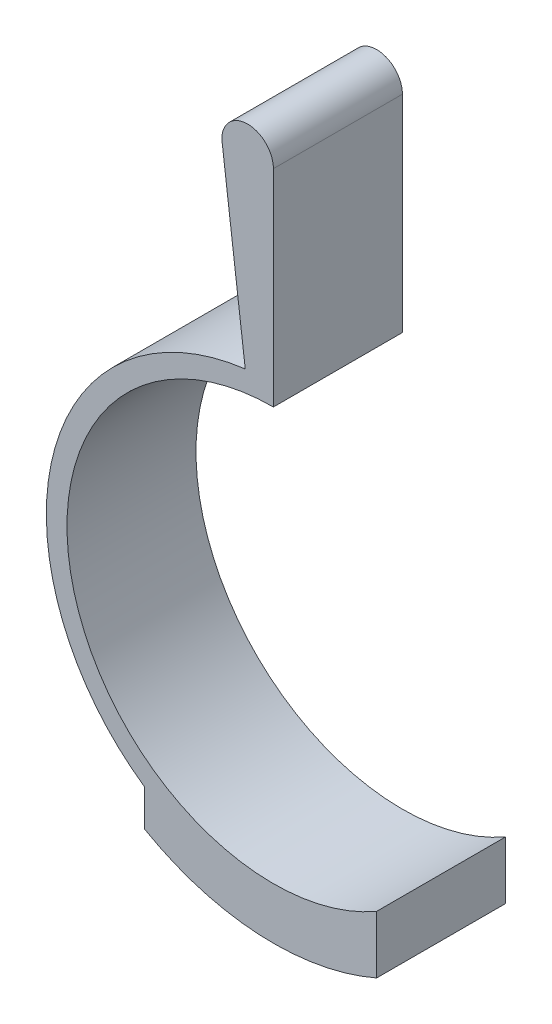
ISO-10303-21;
HEADER;
FILE_DESCRIPTION(('STEP AP214'),'2;1');
FILE_NAME('part.step','',(''),(''),'','','');
FILE_SCHEMA(('AUTOMOTIVE_DESIGN { 1 0 10303 214 1 1 1 1 }'));
ENDSEC;
DATA;
#1=APPLICATION_CONTEXT('core data for automotive mechanical design processes');
#2=APPLICATION_PROTOCOL_DEFINITION('international standard','automotive_design',2000,#1);
#3=PRODUCT_CONTEXT('',#1,'mechanical');
#4=PRODUCT('Part','Part','',(#3));
#5=PRODUCT_RELATED_PRODUCT_CATEGORY('part','',(#4));
#6=PRODUCT_DEFINITION_FORMATION('','',#4);
#7=PRODUCT_DEFINITION_CONTEXT('part definition',#1,'design');
#8=PRODUCT_DEFINITION('design','',#6,#7);
#9=PRODUCT_DEFINITION_SHAPE('','',#8);
#10=(LENGTH_UNIT() NAMED_UNIT(*) SI_UNIT(.MILLI.,.METRE.));
#11=(NAMED_UNIT(*) PLANE_ANGLE_UNIT() SI_UNIT($,.RADIAN.));
#12=(NAMED_UNIT(*) SI_UNIT($,.STERADIAN.) SOLID_ANGLE_UNIT());
#13=UNCERTAINTY_MEASURE_WITH_UNIT(LENGTH_MEASURE(1.E-05),#10,'distance_accuracy_value','');
#14=(GEOMETRIC_REPRESENTATION_CONTEXT(3) GLOBAL_UNCERTAINTY_ASSIGNED_CONTEXT((#13)) GLOBAL_UNIT_ASSIGNED_CONTEXT((#10,
#11,#12)) REPRESENTATION_CONTEXT('',''));
#15=CARTESIAN_POINT('',(0.,0.,0.));
#16=DIRECTION('',(0.,0.,1.));
#17=DIRECTION('',(1.,0.,0.));
#18=AXIS2_PLACEMENT_3D('',#15,#16,#17);
#19=CARTESIAN_POINT('',(-12.5,0.,12.5));
#20=DIRECTION('',(1.,0.,0.));
#21=DIRECTION('',(0.,0.,-1.));
#22=AXIS2_PLACEMENT_3D('',#19,#20,#21);
#23=PLANE('',#22);
#24=DIRECTION('',(0.,-1.,0.));
#25=VECTOR('',#24,1.);
#26=CARTESIAN_POINT('',(-12.5,0.,0.));
#27=LINE('',#26,#25);
#28=CARTESIAN_POINT('',(-12.5,-18.1038669902317,0.));
#29=VERTEX_POINT('',#28);
#30=CARTESIAN_POINT('',(-12.5,-21.650635094611,0.));
#31=VERTEX_POINT('',#30);
#32=EDGE_CURVE('E132',#29,#31,#27,.T.);
#33=ORIENTED_EDGE('',*,*,#32,.T.);
#34=DIRECTION('',(0.,0.,-1.));
#35=VECTOR('',#34,1.);
#36=CARTESIAN_POINT('',(-12.5,-21.650635094611,12.5));
#37=LINE('',#36,#35);
#38=CARTESIAN_POINT('',(-12.5,-21.650635094611,12.5));
#39=VERTEX_POINT('',#38);
#40=EDGE_CURVE('E11',#39,#31,#37,.T.);
#41=ORIENTED_EDGE('',*,*,#40,.F.);
#42=DIRECTION('',(0.,-1.,0.));
#43=VECTOR('',#42,1.);
#44=CARTESIAN_POINT('',(-12.5,0.,12.5));
#45=LINE('',#44,#43);
#46=CARTESIAN_POINT('',(-12.5,-18.1038669902317,12.5));
#47=VERTEX_POINT('',#46);
#48=EDGE_CURVE('E149',#47,#39,#45,.T.);
#49=ORIENTED_EDGE('',*,*,#48,.F.);
#50=DIRECTION('',(0.,0.,-1.));
#51=VECTOR('',#50,1.);
#52=CARTESIAN_POINT('',(-12.5,-18.1038669902317,12.5));
#53=LINE('',#52,#51);
#54=EDGE_CURVE('E128',#47,#29,#53,.T.);
#55=ORIENTED_EDGE('',*,*,#54,.T.);
#56=EDGE_LOOP('',(#33,#41,#49,#55));
#57=FACE_BOUND('',#56,.T.);
#58=ADVANCED_FACE('F35',(#57),#23,.F.);
#59=CARTESIAN_POINT('',(0.,0.,12.5));
#60=DIRECTION('',(0.,0.,-1.));
#61=DIRECTION('',(-1.,0.,0.));
#62=AXIS2_PLACEMENT_3D('',#59,#60,#61);
#63=CYLINDRICAL_SURFACE('',#62,25.);
#64=CARTESIAN_POINT('',(0.,0.,0.));
#65=DIRECTION('',(0.,0.,1.));
#66=DIRECTION('',(1.,0.,0.));
#67=AXIS2_PLACEMENT_3D('',#64,#65,#66);
#68=CIRCLE('',#67,25.);
#69=CARTESIAN_POINT('',(10.,-22.9128784747792,0.));
#70=VERTEX_POINT('',#69);
#71=EDGE_CURVE('E135',#31,#70,#68,.T.);
#72=ORIENTED_EDGE('',*,*,#71,.T.);
#73=DIRECTION('',(0.,0.,-1.));
#74=VECTOR('',#73,1.);
#75=CARTESIAN_POINT('',(10.,-22.9128784747792,12.5));
#76=LINE('',#75,#74);
#77=CARTESIAN_POINT('',(10.,-22.9128784747792,12.5));
#78=VERTEX_POINT('',#77);
#79=EDGE_CURVE('E43',#78,#70,#76,.T.);
#80=ORIENTED_EDGE('',*,*,#79,.F.);
#81=CARTESIAN_POINT('',(0.,0.,12.5));
#82=DIRECTION('',(0.,0.,1.));
#83=DIRECTION('',(1.,0.,0.));
#84=AXIS2_PLACEMENT_3D('',#81,#82,#83);
#85=CIRCLE('',#84,25.);
#86=EDGE_CURVE('E94',#39,#78,#85,.T.);
#87=ORIENTED_EDGE('',*,*,#86,.F.);
#88=ORIENTED_EDGE('',*,*,#40,.T.);
#89=EDGE_LOOP('',(#72,#80,#87,#88));
#90=FACE_BOUND('',#89,.T.);
#91=ADVANCED_FACE('F162',(#90),#63,.T.);
#92=CARTESIAN_POINT('',(9.99999999999999,0.,12.5));
#93=DIRECTION('',(1.,0.,0.));
#94=DIRECTION('',(0.,1.,0.));
#95=AXIS2_PLACEMENT_3D('',#92,#93,#94);
#96=PLANE('',#95);
#97=DIRECTION('',(0.,-1.,0.));
#98=VECTOR('',#97,1.);
#99=CARTESIAN_POINT('',(9.99999999999999,0.,0.));
#100=LINE('',#99,#98);
#101=CARTESIAN_POINT('',(10.,-17.3205080756888,0.));
#102=VERTEX_POINT('',#101);
#103=EDGE_CURVE('E138',#102,#70,#100,.T.);
#104=ORIENTED_EDGE('',*,*,#103,.F.);
#105=DIRECTION('',(0.,0.,-1.));
#106=VECTOR('',#105,1.);
#107=CARTESIAN_POINT('',(10.,-17.3205080756888,12.5));
#108=LINE('',#107,#106);
#109=CARTESIAN_POINT('',(10.,-17.3205080756888,12.5));
#110=VERTEX_POINT('',#109);
#111=EDGE_CURVE('E155',#110,#102,#108,.T.);
#112=ORIENTED_EDGE('',*,*,#111,.F.);
#113=DIRECTION('',(0.,-1.,0.));
#114=VECTOR('',#113,1.);
#115=CARTESIAN_POINT('',(9.99999999999999,0.,12.5));
#116=LINE('',#115,#114);
#117=EDGE_CURVE('E161',#110,#78,#116,.T.);
#118=ORIENTED_EDGE('',*,*,#117,.T.);
#119=ORIENTED_EDGE('',*,*,#79,.T.);
#120=EDGE_LOOP('',(#104,#112,#118,#119));
#121=FACE_BOUND('',#120,.T.);
#122=ADVANCED_FACE('F159',(#121),#96,.T.);
#123=CARTESIAN_POINT('',(0.,0.,12.5));
#124=DIRECTION('',(0.,0.,-1.));
#125=DIRECTION('',(-1.,0.,0.));
#126=AXIS2_PLACEMENT_3D('',#123,#124,#125);
#127=CYLINDRICAL_SURFACE('',#126,20.);
#128=CARTESIAN_POINT('',(0.,0.,0.));
#129=DIRECTION('',(0.,0.,1.));
#130=DIRECTION('',(1.,0.,0.));
#131=AXIS2_PLACEMENT_3D('',#128,#129,#130);
#132=CIRCLE('',#131,20.);
#133=CARTESIAN_POINT('',(0.,20.,0.));
#134=VERTEX_POINT('',#133);
#135=EDGE_CURVE('E141',#134,#102,#132,.T.);
#136=ORIENTED_EDGE('',*,*,#135,.F.);
#137=DIRECTION('',(0.,0.,-1.));
#138=VECTOR('',#137,1.);
#139=CARTESIAN_POINT('',(0.,20.,12.5));
#140=LINE('',#139,#138);
#141=CARTESIAN_POINT('',(0.,20.,12.5));
#142=VERTEX_POINT('',#141);
#143=EDGE_CURVE('E153',#142,#134,#140,.T.);
#144=ORIENTED_EDGE('',*,*,#143,.F.);
#145=CARTESIAN_POINT('',(0.,0.,12.5));
#146=DIRECTION('',(0.,0.,1.));
#147=DIRECTION('',(1.,0.,0.));
#148=AXIS2_PLACEMENT_3D('',#145,#146,#147);
#149=CIRCLE('',#148,20.);
#150=EDGE_CURVE('E172',#142,#110,#149,.T.);
#151=ORIENTED_EDGE('',*,*,#150,.T.);
#152=ORIENTED_EDGE('',*,*,#111,.T.);
#153=EDGE_LOOP('',(#136,#144,#151,#152));
#154=FACE_BOUND('',#153,.T.);
#155=ADVANCED_FACE('F170',(#154),#127,.F.);
#156=CARTESIAN_POINT('',(0.,0.,12.5));
#157=DIRECTION('',(-1.,0.,0.));
#158=DIRECTION('',(0.,0.,1.));
#159=AXIS2_PLACEMENT_3D('',#156,#157,#158);
#160=PLANE('',#159);
#161=DIRECTION('',(0.,1.,0.));
#162=VECTOR('',#161,1.);
#163=CARTESIAN_POINT('',(0.,0.,0.));
#164=LINE('',#163,#162);
#165=CARTESIAN_POINT('',(0.,40.,0.));
#166=VERTEX_POINT('',#165);
#167=EDGE_CURVE('E144',#134,#166,#164,.T.);
#168=ORIENTED_EDGE('',*,*,#167,.T.);
#169=DIRECTION('',(0.,0.,-1.));
#170=VECTOR('',#169,1.);
#171=CARTESIAN_POINT('',(0.,40.,12.5));
#172=LINE('',#171,#170);
#173=CARTESIAN_POINT('',(0.,40.,12.5));
#174=VERTEX_POINT('',#173);
#175=EDGE_CURVE('E123',#174,#166,#172,.T.);
#176=ORIENTED_EDGE('',*,*,#175,.F.);
#177=DIRECTION('',(0.,1.,0.));
#178=VECTOR('',#177,1.);
#179=CARTESIAN_POINT('',(0.,0.,12.5));
#180=LINE('',#179,#178);
#181=EDGE_CURVE('E114',#142,#174,#180,.T.);
#182=ORIENTED_EDGE('',*,*,#181,.F.);
#183=ORIENTED_EDGE('',*,*,#143,.T.);
#184=EDGE_LOOP('',(#168,#176,#182,#183));
#185=FACE_BOUND('',#184,.T.);
#186=ADVANCED_FACE('F200',(#185),#160,.F.);
#187=CARTESIAN_POINT('',(-2.5,40.,12.5));
#188=DIRECTION('',(0.,0.,-1.));
#189=DIRECTION('',(-1.,0.,0.));
#190=AXIS2_PLACEMENT_3D('',#187,#188,#189);
#191=CYLINDRICAL_SURFACE('',#190,2.5);
#192=CARTESIAN_POINT('',(-2.5,40.,0.));
#193=DIRECTION('',(0.,0.,1.));
#194=DIRECTION('',(1.,0.,0.));
#195=AXIS2_PLACEMENT_3D('',#192,#193,#194);
#196=CIRCLE('',#195,2.5);
#197=CARTESIAN_POINT('',(-5.,40.,0.));
#198=VERTEX_POINT('',#197);
#199=EDGE_CURVE('E122',#166,#198,#196,.T.);
#200=ORIENTED_EDGE('',*,*,#199,.T.);
#201=DIRECTION('',(0.,0.,-1.));
#202=VECTOR('',#201,1.);
#203=CARTESIAN_POINT('',(-5.,40.,12.5));
#204=LINE('',#203,#202);
#205=CARTESIAN_POINT('',(-5.,40.,12.5));
#206=VERTEX_POINT('',#205);
#207=EDGE_CURVE('E119',#206,#198,#204,.T.);
#208=ORIENTED_EDGE('',*,*,#207,.F.);
#209=CARTESIAN_POINT('',(-2.5,40.,12.5));
#210=DIRECTION('',(0.,0.,1.));
#211=DIRECTION('',(1.,0.,0.));
#212=AXIS2_PLACEMENT_3D('',#209,#210,#211);
#213=CIRCLE('',#212,2.5);
#214=EDGE_CURVE('E107',#174,#206,#213,.T.);
#215=ORIENTED_EDGE('',*,*,#214,.F.);
#216=ORIENTED_EDGE('',*,*,#175,.T.);
#217=EDGE_LOOP('',(#200,#208,#215,#216));
#218=FACE_BOUND('',#217,.T.);
#219=ADVANCED_FACE('F120',(#218),#191,.T.);
#220=CARTESIAN_POINT('',(0.,0.,12.5));
#221=DIRECTION('',(0.992277876713668,0.124034734589208,0.));
#222=DIRECTION('',(-0.124034734589208,0.992277876713668,0.));
#223=AXIS2_PLACEMENT_3D('',#220,#221,#222);
#224=PLANE('',#223);
#225=DIRECTION('',(0.124034734589208,-0.992277876713668,0.));
#226=VECTOR('',#225,1.);
#227=CARTESIAN_POINT('',(0.,0.,0.));
#228=LINE('',#227,#226);
#229=CARTESIAN_POINT('',(-2.72876416096259,21.8301132877007,0.));
#230=VERTEX_POINT('',#229);
#231=EDGE_CURVE('E80',#198,#230,#228,.T.);
#232=ORIENTED_EDGE('',*,*,#231,.T.);
#233=DIRECTION('',(0.,0.,-1.));
#234=VECTOR('',#233,1.);
#235=CARTESIAN_POINT('',(-2.72876416096259,21.8301132877007,12.5));
#236=LINE('',#235,#234);
#237=CARTESIAN_POINT('',(-2.72876416096259,21.8301132877007,12.5));
#238=VERTEX_POINT('',#237);
#239=EDGE_CURVE('E124',#238,#230,#236,.T.);
#240=ORIENTED_EDGE('',*,*,#239,.F.);
#241=DIRECTION('',(0.124034734589208,-0.992277876713668,0.));
#242=VECTOR('',#241,1.);
#243=CARTESIAN_POINT('',(0.,0.,12.5));
#244=LINE('',#243,#242);
#245=EDGE_CURVE('E111',#206,#238,#244,.T.);
#246=ORIENTED_EDGE('',*,*,#245,.F.);
#247=ORIENTED_EDGE('',*,*,#207,.T.);
#248=EDGE_LOOP('',(#232,#240,#246,#247));
#249=FACE_BOUND('',#248,.T.);
#250=ADVANCED_FACE('F126',(#249),#224,.F.);
#251=CARTESIAN_POINT('',(0.,0.,12.5));
#252=DIRECTION('',(0.,0.,-1.));
#253=DIRECTION('',(-1.,0.,0.));
#254=AXIS2_PLACEMENT_3D('',#251,#252,#253);
#255=CYLINDRICAL_SURFACE('',#254,22.);
#256=CARTESIAN_POINT('',(0.,0.,0.));
#257=DIRECTION('',(0.,0.,1.));
#258=DIRECTION('',(1.,0.,0.));
#259=AXIS2_PLACEMENT_3D('',#256,#257,#258);
#260=CIRCLE('',#259,22.);
#261=EDGE_CURVE('E86',#230,#29,#260,.T.);
#262=ORIENTED_EDGE('',*,*,#261,.T.);
#263=ORIENTED_EDGE('',*,*,#54,.F.);
#264=CARTESIAN_POINT('',(0.,0.,12.5));
#265=DIRECTION('',(0.,0.,1.));
#266=DIRECTION('',(1.,0.,0.));
#267=AXIS2_PLACEMENT_3D('',#264,#265,#266);
#268=CIRCLE('',#267,22.);
#269=EDGE_CURVE('E51',#238,#47,#268,.T.);
#270=ORIENTED_EDGE('',*,*,#269,.F.);
#271=ORIENTED_EDGE('',*,*,#239,.T.);
#272=EDGE_LOOP('',(#262,#263,#270,#271));
#273=FACE_BOUND('',#272,.T.);
#274=ADVANCED_FACE('F179',(#273),#255,.T.);
#275=CARTESIAN_POINT('',(0.,0.,12.5));
#276=DIRECTION('',(0.,0.,1.));
#277=DIRECTION('',(1.,0.,0.));
#278=AXIS2_PLACEMENT_3D('',#275,#276,#277);
#279=PLANE('',#278);
#280=ORIENTED_EDGE('',*,*,#48,.T.);
#281=ORIENTED_EDGE('',*,*,#86,.T.);
#282=ORIENTED_EDGE('',*,*,#117,.F.);
#283=ORIENTED_EDGE('',*,*,#150,.F.);
#284=ORIENTED_EDGE('',*,*,#181,.T.);
#285=ORIENTED_EDGE('',*,*,#214,.T.);
#286=ORIENTED_EDGE('',*,*,#245,.T.);
#287=ORIENTED_EDGE('',*,*,#269,.T.);
#288=EDGE_LOOP('',(#280,#281,#282,#283,#284,#285,#286,#287));
#289=FACE_BOUND('',#288,.T.);
#290=ADVANCED_FACE('F109',(#289),#279,.T.);
#291=CARTESIAN_POINT('',(0.,0.,0.));
#292=DIRECTION('',(0.,0.,1.));
#293=DIRECTION('',(1.,0.,0.));
#294=AXIS2_PLACEMENT_3D('',#291,#292,#293);
#295=PLANE('',#294);
#296=ORIENTED_EDGE('',*,*,#32,.F.);
#297=ORIENTED_EDGE('',*,*,#261,.F.);
#298=ORIENTED_EDGE('',*,*,#231,.F.);
#299=ORIENTED_EDGE('',*,*,#199,.F.);
#300=ORIENTED_EDGE('',*,*,#167,.F.);
#301=ORIENTED_EDGE('',*,*,#135,.T.);
#302=ORIENTED_EDGE('',*,*,#103,.T.);
#303=ORIENTED_EDGE('',*,*,#71,.F.);
#304=EDGE_LOOP('',(#296,#297,#298,#299,#300,#301,#302,#303));
#305=FACE_BOUND('',#304,.T.);
#306=ADVANCED_FACE('F166',(#305),#295,.F.);
#307=CLOSED_SHELL('',(#58,#91,#122,#155,#186,#219,#250,#274,#290,#306));
#308=MANIFOLD_SOLID_BREP('B2',#307);
#309=ADVANCED_BREP_SHAPE_REPRESENTATION('',(#18,#308),#14);
#310=SHAPE_DEFINITION_REPRESENTATION(#9,#309);
ENDSEC;
END-ISO-10303-21;
